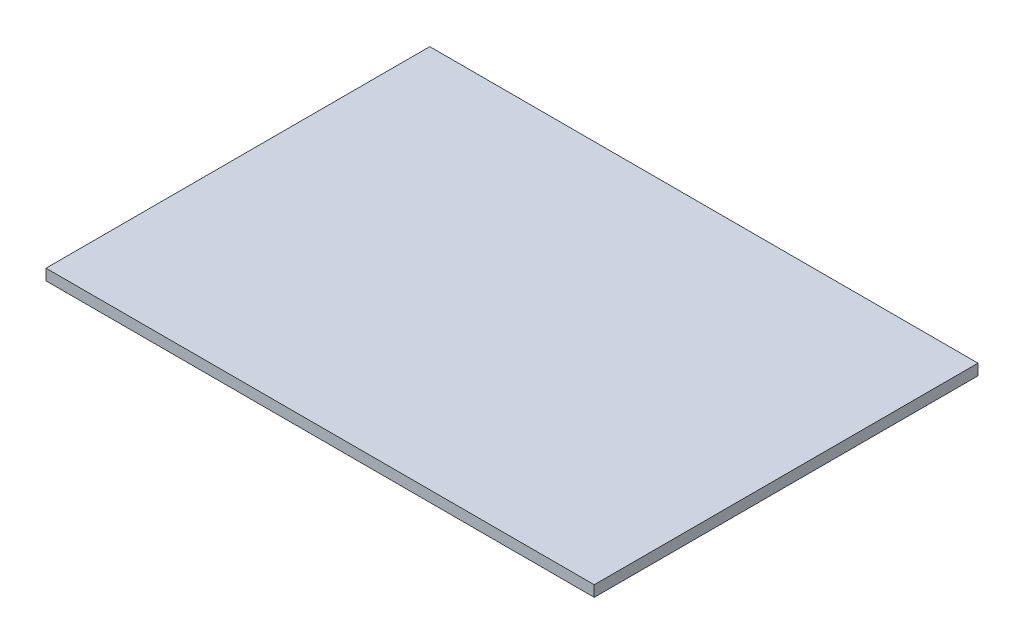
ISO-10303-21;
HEADER;
FILE_DESCRIPTION(('STEP AP214'),'2;1');
FILE_NAME('part.step','',(''),(''),'','','');
FILE_SCHEMA(('AUTOMOTIVE_DESIGN { 1 0 10303 214 1 1 1 1 }'));
ENDSEC;
DATA;
#1=APPLICATION_CONTEXT('core data for automotive mechanical design processes');
#2=APPLICATION_PROTOCOL_DEFINITION('international standard','automotive_design',2000,#1);
#3=PRODUCT_CONTEXT('',#1,'mechanical');
#4=PRODUCT('Part','Part','',(#3));
#5=PRODUCT_RELATED_PRODUCT_CATEGORY('part','',(#4));
#6=PRODUCT_DEFINITION_FORMATION('','',#4);
#7=PRODUCT_DEFINITION_CONTEXT('part definition',#1,'design');
#8=PRODUCT_DEFINITION('design','',#6,#7);
#9=PRODUCT_DEFINITION_SHAPE('','',#8);
#10=(LENGTH_UNIT() NAMED_UNIT(*) SI_UNIT(.MILLI.,.METRE.));
#11=(NAMED_UNIT(*) PLANE_ANGLE_UNIT() SI_UNIT($,.RADIAN.));
#12=(NAMED_UNIT(*) SI_UNIT($,.STERADIAN.) SOLID_ANGLE_UNIT());
#13=UNCERTAINTY_MEASURE_WITH_UNIT(LENGTH_MEASURE(1.E-05),#10,'distance_accuracy_value','');
#14=(GEOMETRIC_REPRESENTATION_CONTEXT(3) GLOBAL_UNCERTAINTY_ASSIGNED_CONTEXT((#13)) GLOBAL_UNIT_ASSIGNED_CONTEXT((#10,
#11,#12)) REPRESENTATION_CONTEXT('',''));
#15=CARTESIAN_POINT('',(0.,0.,0.));
#16=DIRECTION('',(0.,0.,1.));
#17=DIRECTION('',(1.,0.,0.));
#18=AXIS2_PLACEMENT_3D('',#15,#16,#17);
#19=CARTESIAN_POINT('',(25.,1.,-17.5));
#20=DIRECTION('',(-1.,0.,0.));
#21=DIRECTION('',(0.,0.,1.));
#22=AXIS2_PLACEMENT_3D('',#19,#20,#21);
#23=PLANE('',#22);
#24=DIRECTION('',(0.,0.,-1.));
#25=VECTOR('',#24,1.);
#26=CARTESIAN_POINT('',(25.,0.,-17.5));
#27=LINE('',#26,#25);
#28=CARTESIAN_POINT('',(25.,0.,17.5));
#29=VERTEX_POINT('',#28);
#30=CARTESIAN_POINT('',(25.,0.,-17.5));
#31=VERTEX_POINT('',#30);
#32=EDGE_CURVE('E98',#29,#31,#27,.T.);
#33=ORIENTED_EDGE('',*,*,#32,.T.);
#34=DIRECTION('',(0.,-1.,0.));
#35=VECTOR('',#34,1.);
#36=CARTESIAN_POINT('',(25.,1.,-17.5));
#37=LINE('',#36,#35);
#38=CARTESIAN_POINT('',(25.,1.,-17.5));
#39=VERTEX_POINT('',#38);
#40=EDGE_CURVE('E11',#39,#31,#37,.T.);
#41=ORIENTED_EDGE('',*,*,#40,.F.);
#42=DIRECTION('',(0.,0.,-1.));
#43=VECTOR('',#42,1.);
#44=CARTESIAN_POINT('',(25.,1.,-17.5));
#45=LINE('',#44,#43);
#46=CARTESIAN_POINT('',(25.,1.,17.5));
#47=VERTEX_POINT('',#46);
#48=EDGE_CURVE('E86',#47,#39,#45,.T.);
#49=ORIENTED_EDGE('',*,*,#48,.F.);
#50=DIRECTION('',(0.,-1.,0.));
#51=VECTOR('',#50,1.);
#52=CARTESIAN_POINT('',(25.,1.,17.5));
#53=LINE('',#52,#51);
#54=EDGE_CURVE('E94',#47,#29,#53,.T.);
#55=ORIENTED_EDGE('',*,*,#54,.T.);
#56=EDGE_LOOP('',(#33,#41,#49,#55));
#57=FACE_BOUND('',#56,.T.);
#58=ADVANCED_FACE('F35',(#57),#23,.F.);
#59=CARTESIAN_POINT('',(-25.,1.,-17.5));
#60=DIRECTION('',(0.,0.,1.));
#61=DIRECTION('',(1.,0.,0.));
#62=AXIS2_PLACEMENT_3D('',#59,#60,#61);
#63=PLANE('',#62);
#64=DIRECTION('',(-1.,0.,0.));
#65=VECTOR('',#64,1.);
#66=CARTESIAN_POINT('',(-25.,0.,-17.5));
#67=LINE('',#66,#65);
#68=CARTESIAN_POINT('',(-25.,0.,-17.5));
#69=VERTEX_POINT('',#68);
#70=EDGE_CURVE('E90',#31,#69,#67,.T.);
#71=ORIENTED_EDGE('',*,*,#70,.T.);
#72=DIRECTION('',(0.,-1.,0.));
#73=VECTOR('',#72,1.);
#74=CARTESIAN_POINT('',(-25.,1.,-17.5));
#75=LINE('',#74,#73);
#76=CARTESIAN_POINT('',(-25.,1.,-17.5));
#77=VERTEX_POINT('',#76);
#78=EDGE_CURVE('E43',#77,#69,#75,.T.);
#79=ORIENTED_EDGE('',*,*,#78,.F.);
#80=DIRECTION('',(-1.,0.,0.));
#81=VECTOR('',#80,1.);
#82=CARTESIAN_POINT('',(-25.,1.,-17.5));
#83=LINE('',#82,#81);
#84=EDGE_CURVE('E81',#39,#77,#83,.T.);
#85=ORIENTED_EDGE('',*,*,#84,.F.);
#86=ORIENTED_EDGE('',*,*,#40,.T.);
#87=EDGE_LOOP('',(#71,#79,#85,#86));
#88=FACE_BOUND('',#87,.T.);
#89=ADVANCED_FACE('F89',(#88),#63,.F.);
#90=CARTESIAN_POINT('',(-25.,1.,-17.5));
#91=DIRECTION('',(1.,0.,0.));
#92=DIRECTION('',(0.,0.,-1.));
#93=AXIS2_PLACEMENT_3D('',#90,#91,#92);
#94=PLANE('',#93);
#95=DIRECTION('',(0.,0.,1.));
#96=VECTOR('',#95,1.);
#97=CARTESIAN_POINT('',(-25.,0.,-17.5));
#98=LINE('',#97,#96);
#99=CARTESIAN_POINT('',(-25.,0.,17.5));
#100=VERTEX_POINT('',#99);
#101=EDGE_CURVE('E68',#69,#100,#98,.T.);
#102=ORIENTED_EDGE('',*,*,#101,.T.);
#103=DIRECTION('',(0.,-1.,0.));
#104=VECTOR('',#103,1.);
#105=CARTESIAN_POINT('',(-25.,1.,17.5));
#106=LINE('',#105,#104);
#107=CARTESIAN_POINT('',(-25.,1.,17.5));
#108=VERTEX_POINT('',#107);
#109=EDGE_CURVE('E91',#108,#100,#106,.T.);
#110=ORIENTED_EDGE('',*,*,#109,.F.);
#111=DIRECTION('',(0.,0.,1.));
#112=VECTOR('',#111,1.);
#113=CARTESIAN_POINT('',(-25.,1.,-17.5));
#114=LINE('',#113,#112);
#115=EDGE_CURVE('E84',#77,#108,#114,.T.);
#116=ORIENTED_EDGE('',*,*,#115,.F.);
#117=ORIENTED_EDGE('',*,*,#78,.T.);
#118=EDGE_LOOP('',(#102,#110,#116,#117));
#119=FACE_BOUND('',#118,.T.);
#120=ADVANCED_FACE('F92',(#119),#94,.F.);
#121=CARTESIAN_POINT('',(-25.,1.,17.5));
#122=DIRECTION('',(0.,0.,-1.));
#123=DIRECTION('',(-1.,0.,0.));
#124=AXIS2_PLACEMENT_3D('',#121,#122,#123);
#125=PLANE('',#124);
#126=DIRECTION('',(1.,0.,0.));
#127=VECTOR('',#126,1.);
#128=CARTESIAN_POINT('',(-25.,0.,17.5));
#129=LINE('',#128,#127);
#130=EDGE_CURVE('E74',#100,#29,#129,.T.);
#131=ORIENTED_EDGE('',*,*,#130,.T.);
#132=ORIENTED_EDGE('',*,*,#54,.F.);
#133=DIRECTION('',(1.,0.,0.));
#134=VECTOR('',#133,1.);
#135=CARTESIAN_POINT('',(-25.,1.,17.5));
#136=LINE('',#135,#134);
#137=EDGE_CURVE('E51',#108,#47,#136,.T.);
#138=ORIENTED_EDGE('',*,*,#137,.F.);
#139=ORIENTED_EDGE('',*,*,#109,.T.);
#140=EDGE_LOOP('',(#131,#132,#138,#139));
#141=FACE_BOUND('',#140,.T.);
#142=ADVANCED_FACE('F105',(#141),#125,.F.);
#143=CARTESIAN_POINT('',(0.,1.,0.));
#144=DIRECTION('',(0.,1.,0.));
#145=DIRECTION('',(0.,0.,1.));
#146=AXIS2_PLACEMENT_3D('',#143,#144,#145);
#147=PLANE('',#146);
#148=ORIENTED_EDGE('',*,*,#48,.T.);
#149=ORIENTED_EDGE('',*,*,#84,.T.);
#150=ORIENTED_EDGE('',*,*,#115,.T.);
#151=ORIENTED_EDGE('',*,*,#137,.T.);
#152=EDGE_LOOP('',(#148,#149,#150,#151));
#153=FACE_BOUND('',#152,.T.);
#154=ADVANCED_FACE('F82',(#153),#147,.T.);
#155=CARTESIAN_POINT('',(0.,0.,0.));
#156=DIRECTION('',(0.,1.,0.));
#157=DIRECTION('',(0.,0.,1.));
#158=AXIS2_PLACEMENT_3D('',#155,#156,#157);
#159=PLANE('',#158);
#160=ORIENTED_EDGE('',*,*,#32,.F.);
#161=ORIENTED_EDGE('',*,*,#130,.F.);
#162=ORIENTED_EDGE('',*,*,#101,.F.);
#163=ORIENTED_EDGE('',*,*,#70,.F.);
#164=EDGE_LOOP('',(#160,#161,#162,#163));
#165=FACE_BOUND('',#164,.T.);
#166=ADVANCED_FACE('F108',(#165),#159,.F.);
#167=CLOSED_SHELL('',(#58,#89,#120,#142,#154,#166));
#168=MANIFOLD_SOLID_BREP('B2',#167);
#169=ADVANCED_BREP_SHAPE_REPRESENTATION('',(#18,#168),#14);
#170=SHAPE_DEFINITION_REPRESENTATION(#9,#169);
ENDSEC;
END-ISO-10303-21;
